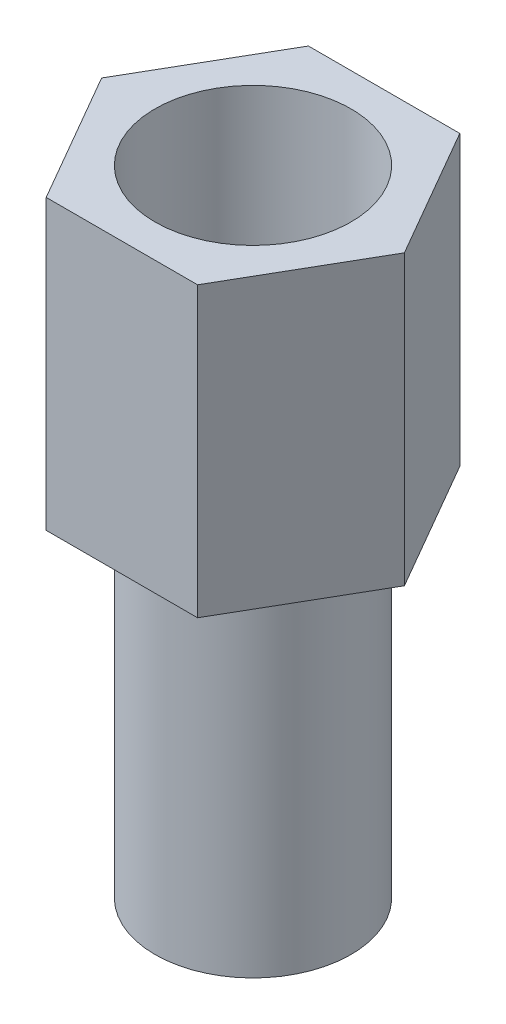
ISO-10303-21;
HEADER;
FILE_DESCRIPTION(('STEP AP214'),'2;1');
FILE_NAME('part.step','',(''),(''),'','','');
FILE_SCHEMA(('AUTOMOTIVE_DESIGN { 1 0 10303 214 1 1 1 1 }'));
ENDSEC;
DATA;
#1=APPLICATION_CONTEXT('core data for automotive mechanical design processes');
#2=APPLICATION_PROTOCOL_DEFINITION('international standard','automotive_design',2000,#1);
#3=PRODUCT_CONTEXT('',#1,'mechanical');
#4=PRODUCT('Part','Part','',(#3));
#5=PRODUCT_RELATED_PRODUCT_CATEGORY('part','',(#4));
#6=PRODUCT_DEFINITION_FORMATION('','',#4);
#7=PRODUCT_DEFINITION_CONTEXT('part definition',#1,'design');
#8=PRODUCT_DEFINITION('design','',#6,#7);
#9=PRODUCT_DEFINITION_SHAPE('','',#8);
#10=(LENGTH_UNIT() NAMED_UNIT(*) SI_UNIT(.MILLI.,.METRE.));
#11=(NAMED_UNIT(*) PLANE_ANGLE_UNIT() SI_UNIT($,.RADIAN.));
#12=(NAMED_UNIT(*) SI_UNIT($,.STERADIAN.) SOLID_ANGLE_UNIT());
#13=UNCERTAINTY_MEASURE_WITH_UNIT(LENGTH_MEASURE(1.E-05),#10,'distance_accuracy_value','');
#14=(GEOMETRIC_REPRESENTATION_CONTEXT(3) GLOBAL_UNCERTAINTY_ASSIGNED_CONTEXT((#13)) GLOBAL_UNIT_ASSIGNED_CONTEXT((#10,
#11,#12)) REPRESENTATION_CONTEXT('',''));
#15=CARTESIAN_POINT('',(0.,0.,0.));
#16=DIRECTION('',(0.,0.,1.));
#17=DIRECTION('',(1.,0.,0.));
#18=AXIS2_PLACEMENT_3D('',#15,#16,#17);
#19=CARTESIAN_POINT('',(1.31249999999999,5.,-2.27331668493415));
#20=DIRECTION('',(-0.866025403784438,0.,0.500000000000001));
#21=DIRECTION('',(0.500000000000001,0.,0.866025403784438));
#22=AXIS2_PLACEMENT_3D('',#19,#20,#21);
#23=PLANE('',#22);
#24=DIRECTION('',(-0.500000000000001,0.,-0.866025403784438));
#25=VECTOR('',#24,1.);
#26=CARTESIAN_POINT('',(1.31249999999999,0.,-2.27331668493415));
#27=LINE('',#26,#25);
#28=CARTESIAN_POINT('',(2.625,0.,0.));
#29=VERTEX_POINT('',#28);
#30=CARTESIAN_POINT('',(1.31249999999999,0.,-2.27331668493415));
#31=VERTEX_POINT('',#30);
#32=EDGE_CURVE('E127',#29,#31,#27,.T.);
#33=ORIENTED_EDGE('',*,*,#32,.T.);
#34=DIRECTION('',(0.,-1.,0.));
#35=VECTOR('',#34,1.);
#36=CARTESIAN_POINT('',(1.31249999999999,5.,-2.27331668493415));
#37=LINE('',#36,#35);
#38=CARTESIAN_POINT('',(1.31249999999999,5.,-2.27331668493415));
#39=VERTEX_POINT('',#38);
#40=EDGE_CURVE('E11',#39,#31,#37,.T.);
#41=ORIENTED_EDGE('',*,*,#40,.F.);
#42=DIRECTION('',(-0.500000000000001,0.,-0.866025403784438));
#43=VECTOR('',#42,1.);
#44=CARTESIAN_POINT('',(1.31249999999999,5.,-2.27331668493415));
#45=LINE('',#44,#43);
#46=CARTESIAN_POINT('',(2.625,5.,0.));
#47=VERTEX_POINT('',#46);
#48=EDGE_CURVE('E144',#47,#39,#45,.T.);
#49=ORIENTED_EDGE('',*,*,#48,.F.);
#50=DIRECTION('',(0.,-1.,0.));
#51=VECTOR('',#50,1.);
#52=CARTESIAN_POINT('',(2.625,5.,0.));
#53=LINE('',#52,#51);
#54=EDGE_CURVE('E123',#47,#29,#53,.T.);
#55=ORIENTED_EDGE('',*,*,#54,.T.);
#56=EDGE_LOOP('',(#33,#41,#49,#55));
#57=FACE_BOUND('',#56,.T.);
#58=ADVANCED_FACE('F38',(#57),#23,.F.);
#59=CARTESIAN_POINT('',(1.31249999999999,5.,-2.27331668493415));
#60=DIRECTION('',(0.,0.,1.));
#61=DIRECTION('',(1.,0.,0.));
#62=AXIS2_PLACEMENT_3D('',#59,#60,#61);
#63=PLANE('',#62);
#64=DIRECTION('',(-1.,0.,0.));
#65=VECTOR('',#64,1.);
#66=CARTESIAN_POINT('',(1.31249999999999,0.,-2.27331668493415));
#67=LINE('',#66,#65);
#68=CARTESIAN_POINT('',(-1.3125,0.,-2.27331668493415));
#69=VERTEX_POINT('',#68);
#70=EDGE_CURVE('E131',#31,#69,#67,.T.);
#71=ORIENTED_EDGE('',*,*,#70,.T.);
#72=DIRECTION('',(0.,-1.,0.));
#73=VECTOR('',#72,1.);
#74=CARTESIAN_POINT('',(-1.3125,5.,-2.27331668493415));
#75=LINE('',#74,#73);
#76=CARTESIAN_POINT('',(-1.3125,5.,-2.27331668493415));
#77=VERTEX_POINT('',#76);
#78=EDGE_CURVE('E47',#77,#69,#75,.T.);
#79=ORIENTED_EDGE('',*,*,#78,.F.);
#80=DIRECTION('',(-1.,0.,0.));
#81=VECTOR('',#80,1.);
#82=CARTESIAN_POINT('',(1.31249999999999,5.,-2.27331668493415));
#83=LINE('',#82,#81);
#84=EDGE_CURVE('E92',#39,#77,#83,.T.);
#85=ORIENTED_EDGE('',*,*,#84,.F.);
#86=ORIENTED_EDGE('',*,*,#40,.T.);
#87=EDGE_LOOP('',(#71,#79,#85,#86));
#88=FACE_BOUND('',#87,.T.);
#89=ADVANCED_FACE('F174',(#88),#63,.F.);
#90=CARTESIAN_POINT('',(-1.3125,5.,-2.27331668493415));
#91=DIRECTION('',(0.866025403784439,0.,0.5));
#92=DIRECTION('',(0.5,0.,-0.866025403784439));
#93=AXIS2_PLACEMENT_3D('',#90,#91,#92);
#94=PLANE('',#93);
#95=DIRECTION('',(-0.5,0.,0.866025403784439));
#96=VECTOR('',#95,1.);
#97=CARTESIAN_POINT('',(-1.3125,0.,-2.27331668493415));
#98=LINE('',#97,#96);
#99=CARTESIAN_POINT('',(-2.625,0.,0.));
#100=VERTEX_POINT('',#99);
#101=EDGE_CURVE('E135',#69,#100,#98,.T.);
#102=ORIENTED_EDGE('',*,*,#101,.T.);
#103=DIRECTION('',(0.,-1.,0.));
#104=VECTOR('',#103,1.);
#105=CARTESIAN_POINT('',(-2.625,5.,0.));
#106=LINE('',#105,#104);
#107=CARTESIAN_POINT('',(-2.625,5.,0.));
#108=VERTEX_POINT('',#107);
#109=EDGE_CURVE('E116',#108,#100,#106,.T.);
#110=ORIENTED_EDGE('',*,*,#109,.F.);
#111=DIRECTION('',(-0.5,0.,0.866025403784439));
#112=VECTOR('',#111,1.);
#113=CARTESIAN_POINT('',(-1.3125,5.,-2.27331668493415));
#114=LINE('',#113,#112);
#115=EDGE_CURVE('E105',#77,#108,#114,.T.);
#116=ORIENTED_EDGE('',*,*,#115,.F.);
#117=ORIENTED_EDGE('',*,*,#78,.T.);
#118=EDGE_LOOP('',(#102,#110,#116,#117));
#119=FACE_BOUND('',#118,.T.);
#120=ADVANCED_FACE('F154',(#119),#94,.F.);
#121=CARTESIAN_POINT('',(-1.3125,5.,2.27331668493415));
#122=DIRECTION('',(0.866025403784438,0.,-0.5));
#123=DIRECTION('',(-0.5,0.,-0.866025403784439));
#124=AXIS2_PLACEMENT_3D('',#121,#122,#123);
#125=PLANE('',#124);
#126=DIRECTION('',(0.5,0.,0.866025403784439));
#127=VECTOR('',#126,1.);
#128=CARTESIAN_POINT('',(-1.3125,0.,2.27331668493415));
#129=LINE('',#128,#127);
#130=CARTESIAN_POINT('',(-1.3125,0.,2.27331668493415));
#131=VERTEX_POINT('',#130);
#132=EDGE_CURVE('E114',#100,#131,#129,.T.);
#133=ORIENTED_EDGE('',*,*,#132,.T.);
#134=DIRECTION('',(0.,-1.,0.));
#135=VECTOR('',#134,1.);
#136=CARTESIAN_POINT('',(-1.3125,5.,2.27331668493415));
#137=LINE('',#136,#135);
#138=CARTESIAN_POINT('',(-1.3125,5.,2.27331668493415));
#139=VERTEX_POINT('',#138);
#140=EDGE_CURVE('E111',#139,#131,#137,.T.);
#141=ORIENTED_EDGE('',*,*,#140,.F.);
#142=DIRECTION('',(0.5,0.,0.866025403784439));
#143=VECTOR('',#142,1.);
#144=CARTESIAN_POINT('',(-1.3125,5.,2.27331668493415));
#145=LINE('',#144,#143);
#146=EDGE_CURVE('E99',#108,#139,#145,.T.);
#147=ORIENTED_EDGE('',*,*,#146,.F.);
#148=ORIENTED_EDGE('',*,*,#109,.T.);
#149=EDGE_LOOP('',(#133,#141,#147,#148));
#150=FACE_BOUND('',#149,.T.);
#151=ADVANCED_FACE('F112',(#150),#125,.F.);
#152=CARTESIAN_POINT('',(1.31249999999999,5.,2.27331668493415));
#153=DIRECTION('',(0.,0.,-1.));
#154=DIRECTION('',(-1.,0.,0.));
#155=AXIS2_PLACEMENT_3D('',#152,#153,#154);
#156=PLANE('',#155);
#157=DIRECTION('',(1.,0.,0.));
#158=VECTOR('',#157,1.);
#159=CARTESIAN_POINT('',(1.31249999999999,0.,2.27331668493415));
#160=LINE('',#159,#158);
#161=CARTESIAN_POINT('',(1.31249999999999,0.,2.27331668493415));
#162=VERTEX_POINT('',#161);
#163=EDGE_CURVE('E78',#131,#162,#160,.T.);
#164=ORIENTED_EDGE('',*,*,#163,.T.);
#165=DIRECTION('',(0.,-1.,0.));
#166=VECTOR('',#165,1.);
#167=CARTESIAN_POINT('',(1.31249999999999,5.,2.27331668493415));
#168=LINE('',#167,#166);
#169=CARTESIAN_POINT('',(1.31249999999999,5.,2.27331668493415));
#170=VERTEX_POINT('',#169);
#171=EDGE_CURVE('E117',#170,#162,#168,.T.);
#172=ORIENTED_EDGE('',*,*,#171,.F.);
#173=DIRECTION('',(1.,0.,0.));
#174=VECTOR('',#173,1.);
#175=CARTESIAN_POINT('',(1.31249999999999,5.,2.27331668493415));
#176=LINE('',#175,#174);
#177=EDGE_CURVE('E103',#139,#170,#176,.T.);
#178=ORIENTED_EDGE('',*,*,#177,.F.);
#179=ORIENTED_EDGE('',*,*,#140,.T.);
#180=EDGE_LOOP('',(#164,#172,#178,#179));
#181=FACE_BOUND('',#180,.T.);
#182=ADVANCED_FACE('F119',(#181),#156,.F.);
#183=CARTESIAN_POINT('',(1.31249999999999,5.,2.27331668493415));
#184=DIRECTION('',(-0.866025403784438,0.,-0.500000000000001));
#185=DIRECTION('',(-0.500000000000001,0.,0.866025403784438));
#186=AXIS2_PLACEMENT_3D('',#183,#184,#185);
#187=PLANE('',#186);
#188=DIRECTION('',(0.500000000000001,0.,-0.866025403784438));
#189=VECTOR('',#188,1.);
#190=CARTESIAN_POINT('',(1.31249999999999,0.,2.27331668493415));
#191=LINE('',#190,#189);
#192=EDGE_CURVE('E84',#162,#29,#191,.T.);
#193=ORIENTED_EDGE('',*,*,#192,.T.);
#194=ORIENTED_EDGE('',*,*,#54,.F.);
#195=DIRECTION('',(0.500000000000001,0.,-0.866025403784438));
#196=VECTOR('',#195,1.);
#197=CARTESIAN_POINT('',(1.31249999999999,5.,2.27331668493415));
#198=LINE('',#197,#196);
#199=EDGE_CURVE('E55',#170,#47,#198,.T.);
#200=ORIENTED_EDGE('',*,*,#199,.F.);
#201=ORIENTED_EDGE('',*,*,#171,.T.);
#202=EDGE_LOOP('',(#193,#194,#200,#201));
#203=FACE_BOUND('',#202,.T.);
#204=ADVANCED_FACE('F161',(#203),#187,.F.);
#205=CARTESIAN_POINT('',(0.,5.,0.));
#206=DIRECTION('',(0.,1.,0.));
#207=DIRECTION('',(0.,0.,1.));
#208=AXIS2_PLACEMENT_3D('',#205,#206,#207);
#209=PLANE('',#208);
#210=CARTESIAN_POINT('',(0.,5.,0.));
#211=DIRECTION('',(0.,1.,0.));
#212=DIRECTION('',(0.,0.,1.));
#213=AXIS2_PLACEMENT_3D('',#210,#211,#212);
#214=CIRCLE('',#213,1.7);
#215=CARTESIAN_POINT('',(0.,5.,1.7));
#216=VERTEX_POINT('',#215);
#217=EDGE_CURVE('E256',#216,#216,#214,.T.);
#218=ORIENTED_EDGE('',*,*,#217,.F.);
#219=EDGE_LOOP('',(#218));
#220=FACE_BOUND('',#219,.T.);
#221=ORIENTED_EDGE('',*,*,#48,.T.);
#222=ORIENTED_EDGE('',*,*,#84,.T.);
#223=ORIENTED_EDGE('',*,*,#115,.T.);
#224=ORIENTED_EDGE('',*,*,#146,.T.);
#225=ORIENTED_EDGE('',*,*,#177,.T.);
#226=ORIENTED_EDGE('',*,*,#199,.T.);
#227=EDGE_LOOP('',(#221,#222,#223,#224,#225,#226));
#228=FACE_BOUND('',#227,.T.);
#229=ADVANCED_FACE('F101',(#220,#228),#209,.T.);
#230=CARTESIAN_POINT('',(0.,0.,0.));
#231=DIRECTION('',(0.,1.,0.));
#232=DIRECTION('',(0.,0.,1.));
#233=AXIS2_PLACEMENT_3D('',#230,#231,#232);
#234=PLANE('',#233);
#235=CARTESIAN_POINT('',(0.,0.,0.));
#236=DIRECTION('',(0.,1.,0.));
#237=DIRECTION('',(0.,0.,1.));
#238=AXIS2_PLACEMENT_3D('',#235,#236,#237);
#239=CIRCLE('',#238,1.7);
#240=CARTESIAN_POINT('',(0.,0.,1.7));
#241=VERTEX_POINT('',#240);
#242=EDGE_CURVE('E255',#241,#241,#239,.T.);
#243=ORIENTED_EDGE('',*,*,#242,.T.);
#244=EDGE_LOOP('',(#243));
#245=FACE_BOUND('',#244,.T.);
#246=ORIENTED_EDGE('',*,*,#32,.F.);
#247=ORIENTED_EDGE('',*,*,#192,.F.);
#248=ORIENTED_EDGE('',*,*,#163,.F.);
#249=ORIENTED_EDGE('',*,*,#132,.F.);
#250=ORIENTED_EDGE('',*,*,#101,.F.);
#251=ORIENTED_EDGE('',*,*,#70,.F.);
#252=EDGE_LOOP('',(#246,#247,#248,#249,#250,#251));
#253=FACE_BOUND('',#252,.T.);
#254=ADVANCED_FACE('F157',(#245,#253),#234,.F.);
#255=CARTESIAN_POINT('',(0.,-6.,0.));
#256=DIRECTION('',(0.,1.,0.));
#257=DIRECTION('',(0.,0.,1.));
#258=AXIS2_PLACEMENT_3D('',#255,#256,#257);
#259=CYLINDRICAL_SURFACE('',#258,1.7);
#260=CARTESIAN_POINT('',(0.,-6.,0.));
#261=DIRECTION('',(0.,1.,0.));
#262=DIRECTION('',(0.,0.,1.));
#263=AXIS2_PLACEMENT_3D('',#260,#261,#262);
#264=CIRCLE('',#263,1.7);
#265=CARTESIAN_POINT('',(0.,-6.,1.7));
#266=VERTEX_POINT('',#265);
#267=EDGE_CURVE('E132',#266,#266,#264,.T.);
#268=ORIENTED_EDGE('',*,*,#267,.T.);
#269=EDGE_LOOP('',(#268));
#270=FACE_BOUND('',#269,.T.);
#271=ORIENTED_EDGE('',*,*,#242,.F.);
#272=EDGE_LOOP('',(#271));
#273=FACE_BOUND('',#272,.T.);
#274=ADVANCED_FACE('F206',(#270,#273),#259,.T.);
#275=CARTESIAN_POINT('',(0.,-6.,0.));
#276=DIRECTION('',(0.,1.,0.));
#277=DIRECTION('',(0.,0.,1.));
#278=AXIS2_PLACEMENT_3D('',#275,#276,#277);
#279=PLANE('',#278);
#280=ORIENTED_EDGE('',*,*,#267,.F.);
#281=EDGE_LOOP('',(#280));
#282=FACE_BOUND('',#281,.T.);
#283=ADVANCED_FACE('F215',(#282),#279,.F.);
#284=CARTESIAN_POINT('',(0.,1.,0.));
#285=DIRECTION('',(0.,1.,0.));
#286=DIRECTION('',(0.,0.,1.));
#287=AXIS2_PLACEMENT_3D('',#284,#285,#286);
#288=CYLINDRICAL_SURFACE('',#287,1.7);
#289=CARTESIAN_POINT('',(0.,1.,0.));
#290=DIRECTION('',(0.,1.,0.));
#291=DIRECTION('',(0.,0.,1.));
#292=AXIS2_PLACEMENT_3D('',#289,#290,#291);
#293=CIRCLE('',#292,1.7);
#294=CARTESIAN_POINT('',(0.,1.,1.7));
#295=VERTEX_POINT('',#294);
#296=EDGE_CURVE('E253',#295,#295,#293,.T.);
#297=ORIENTED_EDGE('',*,*,#296,.F.);
#298=EDGE_LOOP('',(#297));
#299=FACE_BOUND('',#298,.T.);
#300=ORIENTED_EDGE('',*,*,#217,.T.);
#301=EDGE_LOOP('',(#300));
#302=FACE_BOUND('',#301,.T.);
#303=ADVANCED_FACE('F224',(#299,#302),#288,.F.);
#304=CARTESIAN_POINT('',(0.,1.,0.));
#305=DIRECTION('',(0.,1.,0.));
#306=DIRECTION('',(0.,0.,1.));
#307=AXIS2_PLACEMENT_3D('',#304,#305,#306);
#308=PLANE('',#307);
#309=ORIENTED_EDGE('',*,*,#296,.T.);
#310=EDGE_LOOP('',(#309));
#311=FACE_BOUND('',#310,.T.);
#312=ADVANCED_FACE('F237',(#311),#308,.T.);
#313=CLOSED_SHELL('',(#58,#89,#120,#151,#182,#204,#229,#254,#274,#283,#303,#312));
#314=MANIFOLD_SOLID_BREP('B2',#313);
#315=ADVANCED_BREP_SHAPE_REPRESENTATION('',(#18,#314),#14);
#316=SHAPE_DEFINITION_REPRESENTATION(#9,#315);
ENDSEC;
END-ISO-10303-21;
